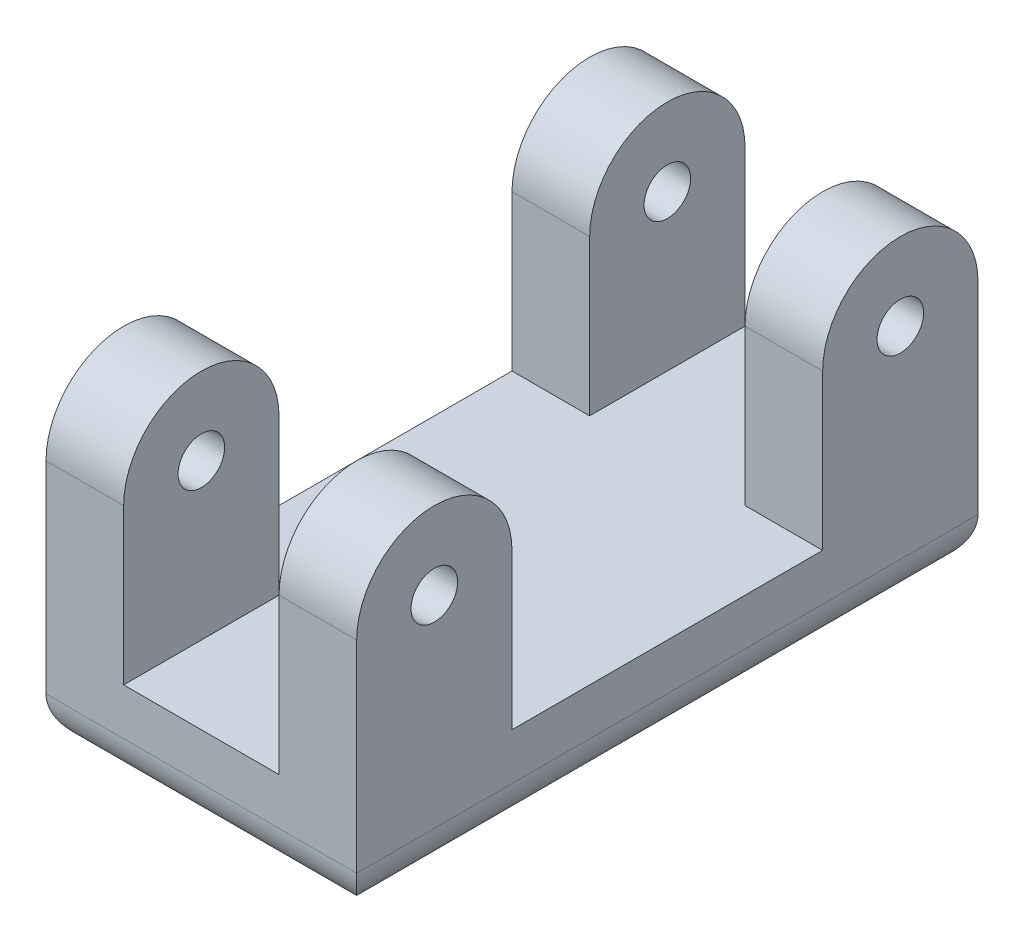
ISO-10303-21;
HEADER;
FILE_DESCRIPTION(('STEP AP214'),'2;1');
FILE_NAME('part.step','',(''),(''),'','','');
FILE_SCHEMA(('AUTOMOTIVE_DESIGN { 1 0 10303 214 1 1 1 1 }'));
ENDSEC;
DATA;
#1=APPLICATION_CONTEXT('core data for automotive mechanical design processes');
#2=APPLICATION_PROTOCOL_DEFINITION('international standard','automotive_design',2000,#1);
#3=PRODUCT_CONTEXT('',#1,'mechanical');
#4=PRODUCT('Part','Part','',(#3));
#5=PRODUCT_RELATED_PRODUCT_CATEGORY('part','',(#4));
#6=PRODUCT_DEFINITION_FORMATION('','',#4);
#7=PRODUCT_DEFINITION_CONTEXT('part definition',#1,'design');
#8=PRODUCT_DEFINITION('design','',#6,#7);
#9=PRODUCT_DEFINITION_SHAPE('','',#8);
#10=(LENGTH_UNIT() NAMED_UNIT(*) SI_UNIT(.MILLI.,.METRE.));
#11=(NAMED_UNIT(*) PLANE_ANGLE_UNIT() SI_UNIT($,.RADIAN.));
#12=(NAMED_UNIT(*) SI_UNIT($,.STERADIAN.) SOLID_ANGLE_UNIT());
#13=UNCERTAINTY_MEASURE_WITH_UNIT(LENGTH_MEASURE(1.E-05),#10,'distance_accuracy_value','');
#14=(GEOMETRIC_REPRESENTATION_CONTEXT(3) GLOBAL_UNCERTAINTY_ASSIGNED_CONTEXT((#13)) GLOBAL_UNIT_ASSIGNED_CONTEXT((#10,
#11,#12)) REPRESENTATION_CONTEXT('',''));
#15=CARTESIAN_POINT('',(0.,0.,0.));
#16=DIRECTION('',(0.,0.,1.));
#17=DIRECTION('',(1.,0.,0.));
#18=AXIS2_PLACEMENT_3D('',#15,#16,#17);
#19=CARTESIAN_POINT('',(-10.,0.,10.));
#20=DIRECTION('',(0.,0.,-1.));
#21=DIRECTION('',(-1.,0.,0.));
#22=AXIS2_PLACEMENT_3D('',#19,#20,#21);
#23=PLANE('',#22);
#24=DIRECTION('',(0.,1.,0.));
#25=VECTOR('',#24,1.);
#26=CARTESIAN_POINT('',(-5.,0.,10.));
#27=LINE('',#26,#25);
#28=CARTESIAN_POINT('',(-5.,3.,10.));
#29=VERTEX_POINT('',#28);
#30=CARTESIAN_POINT('',(-5.,13.,10.));
#31=VERTEX_POINT('',#30);
#32=EDGE_CURVE('E243',#29,#31,#27,.T.);
#33=ORIENTED_EDGE('',*,*,#32,.F.);
#34=DIRECTION('',(1.,0.,0.));
#35=VECTOR('',#34,1.);
#36=CARTESIAN_POINT('',(-10.,3.,10.));
#37=LINE('',#36,#35);
#38=CARTESIAN_POINT('',(-10.,3.,10.));
#39=VERTEX_POINT('',#38);
#40=EDGE_CURVE('E310',#39,#29,#37,.T.);
#41=ORIENTED_EDGE('',*,*,#40,.F.);
#42=DIRECTION('',(0.,1.,0.));
#43=VECTOR('',#42,1.);
#44=CARTESIAN_POINT('',(-10.,0.,10.));
#45=LINE('',#44,#43);
#46=CARTESIAN_POINT('',(-10.,13.,10.));
#47=VERTEX_POINT('',#46);
#48=EDGE_CURVE('E290',#39,#47,#45,.T.);
#49=ORIENTED_EDGE('',*,*,#48,.T.);
#50=DIRECTION('',(1.,0.,0.));
#51=VECTOR('',#50,1.);
#52=CARTESIAN_POINT('',(-10.,13.,10.));
#53=LINE('',#52,#51);
#54=EDGE_CURVE('E321',#47,#31,#53,.T.);
#55=ORIENTED_EDGE('',*,*,#54,.T.);
#56=EDGE_LOOP('',(#33,#41,#49,#55));
#57=FACE_BOUND('',#56,.T.);
#58=ADVANCED_FACE('F41',(#57),#23,.T.);
#59=CARTESIAN_POINT('',(-10.,13.,15.));
#60=DIRECTION('',(1.,0.,0.));
#61=DIRECTION('',(0.,0.,-1.));
#62=AXIS2_PLACEMENT_3D('',#59,#60,#61);
#63=CYLINDRICAL_SURFACE('',#62,1.5);
#64=CARTESIAN_POINT('',(-5.,13.,15.));
#65=DIRECTION('',(-1.,0.,0.));
#66=DIRECTION('',(0.,-1.,0.));
#67=AXIS2_PLACEMENT_3D('',#64,#65,#66);
#68=CIRCLE('',#67,1.5);
#69=CARTESIAN_POINT('',(-5.,11.5,15.));
#70=VERTEX_POINT('',#69);
#71=EDGE_CURVE('E246',#70,#70,#68,.F.);
#72=ORIENTED_EDGE('',*,*,#71,.T.);
#73=EDGE_LOOP('',(#72));
#74=FACE_BOUND('',#73,.T.);
#75=CARTESIAN_POINT('',(-10.,13.,15.));
#76=DIRECTION('',(1.,0.,0.));
#77=DIRECTION('',(0.,0.,-1.));
#78=AXIS2_PLACEMENT_3D('',#75,#76,#77);
#79=CIRCLE('',#78,1.5);
#80=CARTESIAN_POINT('',(-10.,13.,13.5));
#81=VERTEX_POINT('',#80);
#82=EDGE_CURVE('E286',#81,#81,#79,.T.);
#83=ORIENTED_EDGE('',*,*,#82,.F.);
#84=EDGE_LOOP('',(#83));
#85=FACE_BOUND('',#84,.T.);
#86=ADVANCED_FACE('F416',(#74,#85),#63,.F.);
#87=CARTESIAN_POINT('',(-10.,13.,15.));
#88=DIRECTION('',(1.,0.,0.));
#89=DIRECTION('',(0.,0.,-1.));
#90=AXIS2_PLACEMENT_3D('',#87,#88,#89);
#91=CYLINDRICAL_SURFACE('',#90,5.);
#92=DIRECTION('',(1.,0.,0.));
#93=VECTOR('',#92,1.);
#94=CARTESIAN_POINT('',(-10.,13.,20.));
#95=LINE('',#94,#93);
#96=CARTESIAN_POINT('',(-10.,13.,20.));
#97=VERTEX_POINT('',#96);
#98=CARTESIAN_POINT('',(-5.,13.,20.));
#99=VERTEX_POINT('',#98);
#100=EDGE_CURVE('E316',#97,#99,#95,.T.);
#101=ORIENTED_EDGE('',*,*,#100,.T.);
#102=CARTESIAN_POINT('',(-5.,13.,15.));
#103=DIRECTION('',(-1.,0.,0.));
#104=DIRECTION('',(0.,-1.,0.));
#105=AXIS2_PLACEMENT_3D('',#102,#103,#104);
#106=CIRCLE('',#105,5.);
#107=EDGE_CURVE('E240',#31,#99,#106,.F.);
#108=ORIENTED_EDGE('',*,*,#107,.F.);
#109=ORIENTED_EDGE('',*,*,#54,.F.);
#110=CARTESIAN_POINT('',(-10.,13.,15.));
#111=DIRECTION('',(1.,0.,0.));
#112=DIRECTION('',(0.,0.,-1.));
#113=AXIS2_PLACEMENT_3D('',#110,#111,#112);
#114=CIRCLE('',#113,5.);
#115=EDGE_CURVE('E295',#47,#97,#114,.T.);
#116=ORIENTED_EDGE('',*,*,#115,.T.);
#117=EDGE_LOOP('',(#101,#108,#109,#116));
#118=FACE_BOUND('',#117,.T.);
#119=ADVANCED_FACE('F423',(#118),#91,.T.);
#120=CARTESIAN_POINT('',(-10.,13.,-15.));
#121=DIRECTION('',(1.,0.,0.));
#122=DIRECTION('',(0.,0.,-1.));
#123=AXIS2_PLACEMENT_3D('',#120,#121,#122);
#124=CYLINDRICAL_SURFACE('',#123,5.);
#125=CARTESIAN_POINT('',(-5.,13.,-15.));
#126=DIRECTION('',(-1.,0.,0.));
#127=DIRECTION('',(0.,-1.,0.));
#128=AXIS2_PLACEMENT_3D('',#125,#126,#127);
#129=CIRCLE('',#128,5.);
#130=CARTESIAN_POINT('',(-5.,13.,-20.));
#131=VERTEX_POINT('',#130);
#132=CARTESIAN_POINT('',(-5.,13.,-10.));
#133=VERTEX_POINT('',#132);
#134=EDGE_CURVE('E233',#131,#133,#129,.F.);
#135=ORIENTED_EDGE('',*,*,#134,.F.);
#136=DIRECTION('',(1.,0.,0.));
#137=VECTOR('',#136,1.);
#138=CARTESIAN_POINT('',(-10.,13.,-20.));
#139=LINE('',#138,#137);
#140=CARTESIAN_POINT('',(-10.,13.,-20.));
#141=VERTEX_POINT('',#140);
#142=EDGE_CURVE('E197',#141,#131,#139,.T.);
#143=ORIENTED_EDGE('',*,*,#142,.F.);
#144=CARTESIAN_POINT('',(-10.,13.,-15.));
#145=DIRECTION('',(1.,0.,0.));
#146=DIRECTION('',(0.,0.,-1.));
#147=AXIS2_PLACEMENT_3D('',#144,#145,#146);
#148=CIRCLE('',#147,5.);
#149=CARTESIAN_POINT('',(-10.,13.,-10.));
#150=VERTEX_POINT('',#149);
#151=EDGE_CURVE('E255',#141,#150,#148,.T.);
#152=ORIENTED_EDGE('',*,*,#151,.T.);
#153=DIRECTION('',(1.,0.,0.));
#154=VECTOR('',#153,1.);
#155=CARTESIAN_POINT('',(-10.,13.,-10.));
#156=LINE('',#155,#154);
#157=EDGE_CURVE('E282',#150,#133,#156,.T.);
#158=ORIENTED_EDGE('',*,*,#157,.T.);
#159=EDGE_LOOP('',(#135,#143,#152,#158));
#160=FACE_BOUND('',#159,.T.);
#161=ADVANCED_FACE('F480',(#160),#124,.T.);
#162=CARTESIAN_POINT('',(-10.,13.,-15.));
#163=DIRECTION('',(1.,0.,0.));
#164=DIRECTION('',(0.,0.,-1.));
#165=AXIS2_PLACEMENT_3D('',#162,#163,#164);
#166=CYLINDRICAL_SURFACE('',#165,1.5);
#167=CARTESIAN_POINT('',(-5.,13.,-15.));
#168=DIRECTION('',(-1.,0.,0.));
#169=DIRECTION('',(0.,-1.,0.));
#170=AXIS2_PLACEMENT_3D('',#167,#168,#169);
#171=CIRCLE('',#170,1.5);
#172=CARTESIAN_POINT('',(-5.,11.5,-15.));
#173=VERTEX_POINT('',#172);
#174=EDGE_CURVE('E236',#173,#173,#171,.F.);
#175=ORIENTED_EDGE('',*,*,#174,.T.);
#176=EDGE_LOOP('',(#175));
#177=FACE_BOUND('',#176,.T.);
#178=CARTESIAN_POINT('',(-10.,13.,-15.));
#179=DIRECTION('',(1.,0.,0.));
#180=DIRECTION('',(0.,0.,-1.));
#181=AXIS2_PLACEMENT_3D('',#178,#179,#180);
#182=CIRCLE('',#181,1.5);
#183=CARTESIAN_POINT('',(-10.,13.,-16.5));
#184=VERTEX_POINT('',#183);
#185=EDGE_CURVE('E251',#184,#184,#182,.T.);
#186=ORIENTED_EDGE('',*,*,#185,.F.);
#187=EDGE_LOOP('',(#186));
#188=FACE_BOUND('',#187,.T.);
#189=ADVANCED_FACE('F487',(#177,#188),#166,.F.);
#190=CARTESIAN_POINT('',(-10.,0.,-10.));
#191=DIRECTION('',(0.,0.,-1.));
#192=DIRECTION('',(-1.,0.,0.));
#193=AXIS2_PLACEMENT_3D('',#190,#191,#192);
#194=PLANE('',#193);
#195=DIRECTION('',(1.,0.,0.));
#196=VECTOR('',#195,1.);
#197=CARTESIAN_POINT('',(-10.,3.,-10.));
#198=LINE('',#197,#196);
#199=CARTESIAN_POINT('',(-10.,3.,-10.));
#200=VERTEX_POINT('',#199);
#201=CARTESIAN_POINT('',(-5.,3.,-10.));
#202=VERTEX_POINT('',#201);
#203=EDGE_CURVE('E278',#200,#202,#198,.T.);
#204=ORIENTED_EDGE('',*,*,#203,.T.);
#205=DIRECTION('',(0.,1.,0.));
#206=VECTOR('',#205,1.);
#207=CARTESIAN_POINT('',(-5.,0.,-10.));
#208=LINE('',#207,#206);
#209=EDGE_CURVE('E176',#202,#133,#208,.T.);
#210=ORIENTED_EDGE('',*,*,#209,.T.);
#211=ORIENTED_EDGE('',*,*,#157,.F.);
#212=DIRECTION('',(0.,1.,0.));
#213=VECTOR('',#212,1.);
#214=CARTESIAN_POINT('',(-10.,0.,-10.));
#215=LINE('',#214,#213);
#216=EDGE_CURVE('E260',#200,#150,#215,.T.);
#217=ORIENTED_EDGE('',*,*,#216,.F.);
#218=EDGE_LOOP('',(#204,#210,#211,#217));
#219=FACE_BOUND('',#218,.T.);
#220=ADVANCED_FACE('F495',(#219),#194,.F.);
#221=CARTESIAN_POINT('',(-10.,3.,-20.));
#222=DIRECTION('',(0.,1.,0.));
#223=DIRECTION('',(0.,0.,1.));
#224=AXIS2_PLACEMENT_3D('',#221,#222,#223);
#225=PLANE('',#224);
#226=CARTESIAN_POINT('',(5.,3.,-10.));
#227=VERTEX_POINT('',#226);
#228=CARTESIAN_POINT('',(10.,3.,-10.));
#229=VERTEX_POINT('',#228);
#230=EDGE_CURVE('E281',#227,#229,#198,.T.);
#231=ORIENTED_EDGE('',*,*,#230,.F.);
#232=DIRECTION('',(0.,0.,1.));
#233=VECTOR('',#232,1.);
#234=CARTESIAN_POINT('',(5.,3.,-20.));
#235=LINE('',#234,#233);
#236=CARTESIAN_POINT('',(5.,3.,-20.));
#237=VERTEX_POINT('',#236);
#238=EDGE_CURVE('E187',#237,#227,#235,.T.);
#239=ORIENTED_EDGE('',*,*,#238,.F.);
#240=DIRECTION('',(1.,0.,0.));
#241=VECTOR('',#240,1.);
#242=CARTESIAN_POINT('',(-5.,3.,-20.));
#243=LINE('',#242,#241);
#244=CARTESIAN_POINT('',(-5.,3.,-20.));
#245=VERTEX_POINT('',#244);
#246=EDGE_CURVE('E184',#245,#237,#243,.T.);
#247=ORIENTED_EDGE('',*,*,#246,.F.);
#248=DIRECTION('',(0.,0.,1.));
#249=VECTOR('',#248,1.);
#250=CARTESIAN_POINT('',(-5.,3.,-20.));
#251=LINE('',#250,#249);
#252=EDGE_CURVE('E168',#245,#202,#251,.T.);
#253=ORIENTED_EDGE('',*,*,#252,.T.);
#254=ORIENTED_EDGE('',*,*,#203,.F.);
#255=DIRECTION('',(0.,0.,1.));
#256=VECTOR('',#255,1.);
#257=CARTESIAN_POINT('',(-10.,3.,-20.));
#258=LINE('',#257,#256);
#259=EDGE_CURVE('E337',#200,#39,#258,.T.);
#260=ORIENTED_EDGE('',*,*,#259,.T.);
#261=ORIENTED_EDGE('',*,*,#40,.T.);
#262=CARTESIAN_POINT('',(-5.,3.,20.));
#263=VERTEX_POINT('',#262);
#264=EDGE_CURVE('E181',#29,#263,#251,.T.);
#265=ORIENTED_EDGE('',*,*,#264,.T.);
#266=DIRECTION('',(1.,0.,0.));
#267=VECTOR('',#266,1.);
#268=CARTESIAN_POINT('',(-5.,3.,20.));
#269=LINE('',#268,#267);
#270=CARTESIAN_POINT('',(5.,3.,20.));
#271=VERTEX_POINT('',#270);
#272=EDGE_CURVE('E203',#263,#271,#269,.T.);
#273=ORIENTED_EDGE('',*,*,#272,.T.);
#274=CARTESIAN_POINT('',(5.,3.,10.));
#275=VERTEX_POINT('',#274);
#276=EDGE_CURVE('E180',#275,#271,#235,.T.);
#277=ORIENTED_EDGE('',*,*,#276,.F.);
#278=CARTESIAN_POINT('',(10.,3.,10.));
#279=VERTEX_POINT('',#278);
#280=EDGE_CURVE('E315',#275,#279,#37,.T.);
#281=ORIENTED_EDGE('',*,*,#280,.T.);
#282=DIRECTION('',(0.,0.,1.));
#283=VECTOR('',#282,1.);
#284=CARTESIAN_POINT('',(10.,3.,-20.));
#285=LINE('',#284,#283);
#286=EDGE_CURVE('E336',#229,#279,#285,.T.);
#287=ORIENTED_EDGE('',*,*,#286,.F.);
#288=EDGE_LOOP('',(#231,#239,#247,#253,#254,#260,#261,#265,#273,#277,#281,#287));
#289=FACE_BOUND('',#288,.T.);
#290=ADVANCED_FACE('F186',(#289),#225,.T.);
#291=CARTESIAN_POINT('',(10.,3.,-20.));
#292=DIRECTION('',(1.,0.,0.));
#293=DIRECTION('',(0.,0.,-1.));
#294=AXIS2_PLACEMENT_3D('',#291,#292,#293);
#295=PLANE('',#294);
#296=DIRECTION('',(0.,1.,0.));
#297=VECTOR('',#296,1.);
#298=CARTESIAN_POINT('',(10.,3.,20.));
#299=LINE('',#298,#297);
#300=CARTESIAN_POINT('',(10.,0.,20.));
#301=VERTEX_POINT('',#300);
#302=CARTESIAN_POINT('',(10.,13.,20.));
#303=VERTEX_POINT('',#302);
#304=EDGE_CURVE('E314',#301,#303,#299,.T.);
#305=ORIENTED_EDGE('',*,*,#304,.F.);
#306=DIRECTION('',(0.,0.,1.));
#307=VECTOR('',#306,1.);
#308=CARTESIAN_POINT('',(10.,0.,-20.));
#309=LINE('',#308,#307);
#310=CARTESIAN_POINT('',(10.,0.,-20.));
#311=VERTEX_POINT('',#310);
#312=EDGE_CURVE('E11',#301,#311,#309,.F.);
#313=ORIENTED_EDGE('',*,*,#312,.T.);
#314=DIRECTION('',(0.,1.,0.));
#315=VECTOR('',#314,1.);
#316=CARTESIAN_POINT('',(10.,3.,-20.));
#317=LINE('',#316,#315);
#318=CARTESIAN_POINT('',(10.,13.,-20.));
#319=VERTEX_POINT('',#318);
#320=EDGE_CURVE('E330',#311,#319,#317,.T.);
#321=ORIENTED_EDGE('',*,*,#320,.T.);
#322=CARTESIAN_POINT('',(10.,13.,-15.));
#323=DIRECTION('',(1.,0.,0.));
#324=DIRECTION('',(0.,0.,-1.));
#325=AXIS2_PLACEMENT_3D('',#322,#323,#324);
#326=CIRCLE('',#325,5.);
#327=CARTESIAN_POINT('',(10.,13.,-10.));
#328=VERTEX_POINT('',#327);
#329=EDGE_CURVE('E267',#319,#328,#326,.T.);
#330=ORIENTED_EDGE('',*,*,#329,.T.);
#331=DIRECTION('',(0.,1.,0.));
#332=VECTOR('',#331,1.);
#333=CARTESIAN_POINT('',(10.,0.,-10.));
#334=LINE('',#333,#332);
#335=EDGE_CURVE('E256',#229,#328,#334,.T.);
#336=ORIENTED_EDGE('',*,*,#335,.F.);
#337=ORIENTED_EDGE('',*,*,#286,.T.);
#338=DIRECTION('',(0.,1.,0.));
#339=VECTOR('',#338,1.);
#340=CARTESIAN_POINT('',(10.,0.,10.));
#341=LINE('',#340,#339);
#342=CARTESIAN_POINT('',(10.,13.,10.));
#343=VERTEX_POINT('',#342);
#344=EDGE_CURVE('E303',#279,#343,#341,.T.);
#345=ORIENTED_EDGE('',*,*,#344,.T.);
#346=CARTESIAN_POINT('',(10.,13.,15.));
#347=DIRECTION('',(1.,0.,0.));
#348=DIRECTION('',(0.,0.,-1.));
#349=AXIS2_PLACEMENT_3D('',#346,#347,#348);
#350=CIRCLE('',#349,5.);
#351=EDGE_CURVE('E291',#343,#303,#350,.T.);
#352=ORIENTED_EDGE('',*,*,#351,.T.);
#353=EDGE_LOOP('',(#305,#313,#321,#330,#336,#337,#345,#352));
#354=FACE_BOUND('',#353,.T.);
#355=CARTESIAN_POINT('',(10.,13.,15.));
#356=DIRECTION('',(1.,0.,0.));
#357=DIRECTION('',(0.,0.,-1.));
#358=AXIS2_PLACEMENT_3D('',#355,#356,#357);
#359=CIRCLE('',#358,1.5);
#360=CARTESIAN_POINT('',(10.,13.,13.5));
#361=VERTEX_POINT('',#360);
#362=EDGE_CURVE('E276',#361,#361,#359,.T.);
#363=ORIENTED_EDGE('',*,*,#362,.F.);
#364=EDGE_LOOP('',(#363));
#365=FACE_BOUND('',#364,.T.);
#366=CARTESIAN_POINT('',(10.,13.,-15.));
#367=DIRECTION('',(1.,0.,0.));
#368=DIRECTION('',(0.,0.,-1.));
#369=AXIS2_PLACEMENT_3D('',#366,#367,#368);
#370=CIRCLE('',#369,1.5);
#371=CARTESIAN_POINT('',(10.,13.,-16.5));
#372=VERTEX_POINT('',#371);
#373=EDGE_CURVE('E250',#372,#372,#370,.T.);
#374=ORIENTED_EDGE('',*,*,#373,.F.);
#375=EDGE_LOOP('',(#374));
#376=FACE_BOUND('',#375,.T.);
#377=ADVANCED_FACE('F394',(#354,#365,#376),#295,.T.);
#378=CARTESIAN_POINT('',(-10.,-3.,-20.));
#379=DIRECTION('',(0.,-1.,0.));
#380=DIRECTION('',(0.,0.,-1.));
#381=AXIS2_PLACEMENT_3D('',#378,#379,#380);
#382=PLANE('',#381);
#383=DIRECTION('',(0.,0.,1.));
#384=VECTOR('',#383,1.);
#385=CARTESIAN_POINT('',(-7.,-3.,-20.));
#386=LINE('',#385,#384);
#387=CARTESIAN_POINT('',(-7.,-3.,17.));
#388=VERTEX_POINT('',#387);
#389=CARTESIAN_POINT('',(-7.,-3.,-17.));
#390=VERTEX_POINT('',#389);
#391=EDGE_CURVE('E355',#388,#390,#386,.F.);
#392=ORIENTED_EDGE('',*,*,#391,.T.);
#393=DIRECTION('',(1.,0.,0.));
#394=VECTOR('',#393,1.);
#395=CARTESIAN_POINT('',(9.99999999999999,-3.,-17.));
#396=LINE('',#395,#394);
#397=CARTESIAN_POINT('',(7.,-3.,-17.));
#398=VERTEX_POINT('',#397);
#399=EDGE_CURVE('E358',#390,#398,#396,.T.);
#400=ORIENTED_EDGE('',*,*,#399,.T.);
#401=DIRECTION('',(0.,0.,1.));
#402=VECTOR('',#401,1.);
#403=CARTESIAN_POINT('',(7.,-3.,-20.));
#404=LINE('',#403,#402);
#405=CARTESIAN_POINT('',(7.,-3.,17.));
#406=VERTEX_POINT('',#405);
#407=EDGE_CURVE('E349',#398,#406,#404,.T.);
#408=ORIENTED_EDGE('',*,*,#407,.T.);
#409=DIRECTION('',(1.,0.,0.));
#410=VECTOR('',#409,1.);
#411=CARTESIAN_POINT('',(-10.,-3.,17.));
#412=LINE('',#411,#410);
#413=EDGE_CURVE('E352',#406,#388,#412,.F.);
#414=ORIENTED_EDGE('',*,*,#413,.T.);
#415=EDGE_LOOP('',(#392,#400,#408,#414));
#416=FACE_BOUND('',#415,.T.);
#417=ADVANCED_FACE('F404',(#416),#382,.T.);
#418=CARTESIAN_POINT('',(-10.,3.,-20.));
#419=DIRECTION('',(-1.,0.,0.));
#420=DIRECTION('',(0.,-1.,0.));
#421=AXIS2_PLACEMENT_3D('',#418,#419,#420);
#422=PLANE('',#421);
#423=DIRECTION('',(0.,-1.,0.));
#424=VECTOR('',#423,1.);
#425=CARTESIAN_POINT('',(-10.,3.,-20.));
#426=LINE('',#425,#424);
#427=CARTESIAN_POINT('',(-10.,0.,-20.));
#428=VERTEX_POINT('',#427);
#429=EDGE_CURVE('E333',#141,#428,#426,.T.);
#430=ORIENTED_EDGE('',*,*,#429,.T.);
#431=DIRECTION('',(0.,0.,1.));
#432=VECTOR('',#431,1.);
#433=CARTESIAN_POINT('',(-10.,0.,-20.));
#434=LINE('',#433,#432);
#435=CARTESIAN_POINT('',(-10.,0.,20.));
#436=VERTEX_POINT('',#435);
#437=EDGE_CURVE('E66',#428,#436,#434,.T.);
#438=ORIENTED_EDGE('',*,*,#437,.T.);
#439=DIRECTION('',(0.,-1.,0.));
#440=VECTOR('',#439,1.);
#441=CARTESIAN_POINT('',(-10.,3.,20.));
#442=LINE('',#441,#440);
#443=EDGE_CURVE('E327',#97,#436,#442,.T.);
#444=ORIENTED_EDGE('',*,*,#443,.F.);
#445=ORIENTED_EDGE('',*,*,#115,.F.);
#446=ORIENTED_EDGE('',*,*,#48,.F.);
#447=ORIENTED_EDGE('',*,*,#259,.F.);
#448=ORIENTED_EDGE('',*,*,#216,.T.);
#449=ORIENTED_EDGE('',*,*,#151,.F.);
#450=EDGE_LOOP('',(#430,#438,#444,#445,#446,#447,#448,#449));
#451=FACE_BOUND('',#450,.T.);
#452=ORIENTED_EDGE('',*,*,#82,.T.);
#453=EDGE_LOOP('',(#452));
#454=FACE_BOUND('',#453,.T.);
#455=ORIENTED_EDGE('',*,*,#185,.T.);
#456=EDGE_LOOP('',(#455));
#457=FACE_BOUND('',#456,.T.);
#458=ADVANCED_FACE('F406',(#451,#454,#457),#422,.T.);
#459=CARTESIAN_POINT('',(0.,0.,-20.));
#460=DIRECTION('',(0.,0.,1.));
#461=DIRECTION('',(1.,0.,0.));
#462=AXIS2_PLACEMENT_3D('',#459,#460,#461);
#463=PLANE('',#462);
#464=ORIENTED_EDGE('',*,*,#320,.F.);
#465=DIRECTION('',(1.,0.,0.));
#466=VECTOR('',#465,1.);
#467=CARTESIAN_POINT('',(-10.,0.,-20.));
#468=LINE('',#467,#466);
#469=EDGE_CURVE('E362',#311,#428,#468,.F.);
#470=ORIENTED_EDGE('',*,*,#469,.T.);
#471=ORIENTED_EDGE('',*,*,#429,.F.);
#472=ORIENTED_EDGE('',*,*,#142,.T.);
#473=DIRECTION('',(0.,-1.,0.));
#474=VECTOR('',#473,1.);
#475=CARTESIAN_POINT('',(-5.,18.,-20.));
#476=LINE('',#475,#474);
#477=EDGE_CURVE('E173',#131,#245,#476,.T.);
#478=ORIENTED_EDGE('',*,*,#477,.T.);
#479=ORIENTED_EDGE('',*,*,#246,.T.);
#480=DIRECTION('',(0.,1.,0.));
#481=VECTOR('',#480,1.);
#482=CARTESIAN_POINT('',(5.,18.,-20.));
#483=LINE('',#482,#481);
#484=CARTESIAN_POINT('',(5.,13.,-20.));
#485=VERTEX_POINT('',#484);
#486=EDGE_CURVE('E192',#237,#485,#483,.T.);
#487=ORIENTED_EDGE('',*,*,#486,.T.);
#488=EDGE_CURVE('E277',#485,#319,#139,.T.);
#489=ORIENTED_EDGE('',*,*,#488,.T.);
#490=EDGE_LOOP('',(#464,#470,#471,#472,#478,#479,#487,#489));
#491=FACE_BOUND('',#490,.T.);
#492=ADVANCED_FACE('F195',(#491),#463,.F.);
#493=CARTESIAN_POINT('',(0.,0.,20.));
#494=DIRECTION('',(0.,0.,1.));
#495=DIRECTION('',(1.,0.,0.));
#496=AXIS2_PLACEMENT_3D('',#493,#494,#495);
#497=PLANE('',#496);
#498=ORIENTED_EDGE('',*,*,#443,.T.);
#499=DIRECTION('',(1.,0.,0.));
#500=VECTOR('',#499,1.);
#501=CARTESIAN_POINT('',(0.,0.,20.));
#502=LINE('',#501,#500);
#503=EDGE_CURVE('E51',#436,#301,#502,.T.);
#504=ORIENTED_EDGE('',*,*,#503,.T.);
#505=ORIENTED_EDGE('',*,*,#304,.T.);
#506=CARTESIAN_POINT('',(5.,13.,20.));
#507=VERTEX_POINT('',#506);
#508=EDGE_CURVE('E320',#507,#303,#95,.T.);
#509=ORIENTED_EDGE('',*,*,#508,.F.);
#510=DIRECTION('',(0.,1.,0.));
#511=VECTOR('',#510,1.);
#512=CARTESIAN_POINT('',(5.,18.,20.));
#513=LINE('',#512,#511);
#514=EDGE_CURVE('E199',#271,#507,#513,.T.);
#515=ORIENTED_EDGE('',*,*,#514,.F.);
#516=ORIENTED_EDGE('',*,*,#272,.F.);
#517=DIRECTION('',(0.,-1.,0.));
#518=VECTOR('',#517,1.);
#519=CARTESIAN_POINT('',(-5.,18.,20.));
#520=LINE('',#519,#518);
#521=EDGE_CURVE('E208',#99,#263,#520,.T.);
#522=ORIENTED_EDGE('',*,*,#521,.F.);
#523=ORIENTED_EDGE('',*,*,#100,.F.);
#524=EDGE_LOOP('',(#498,#504,#505,#509,#515,#516,#522,#523));
#525=FACE_BOUND('',#524,.T.);
#526=ADVANCED_FACE('F430',(#525),#497,.T.);
#527=DIRECTION('',(0.,-1.,0.));
#528=VECTOR('',#527,1.);
#529=CARTESIAN_POINT('',(5.,0.,10.));
#530=LINE('',#529,#528);
#531=CARTESIAN_POINT('',(5.,13.,10.));
#532=VERTEX_POINT('',#531);
#533=EDGE_CURVE('E226',#532,#275,#530,.T.);
#534=ORIENTED_EDGE('',*,*,#533,.F.);
#535=EDGE_CURVE('E299',#532,#343,#53,.T.);
#536=ORIENTED_EDGE('',*,*,#535,.T.);
#537=ORIENTED_EDGE('',*,*,#344,.F.);
#538=ORIENTED_EDGE('',*,*,#280,.F.);
#539=EDGE_LOOP('',(#534,#536,#537,#538));
#540=FACE_BOUND('',#539,.T.);
#541=ADVANCED_FACE('F419',(#540),#23,.T.);
#542=CARTESIAN_POINT('',(5.,13.,15.));
#543=DIRECTION('',(1.,0.,0.));
#544=DIRECTION('',(0.,1.,0.));
#545=AXIS2_PLACEMENT_3D('',#542,#543,#544);
#546=CIRCLE('',#545,1.5);
#547=CARTESIAN_POINT('',(5.,14.5,15.));
#548=VERTEX_POINT('',#547);
#549=EDGE_CURVE('E229',#548,#548,#546,.F.);
#550=ORIENTED_EDGE('',*,*,#549,.T.);
#551=EDGE_LOOP('',(#550));
#552=FACE_BOUND('',#551,.T.);
#553=ORIENTED_EDGE('',*,*,#362,.T.);
#554=EDGE_LOOP('',(#553));
#555=FACE_BOUND('',#554,.T.);
#556=ADVANCED_FACE('F426',(#552,#555),#63,.F.);
#557=CARTESIAN_POINT('',(5.,13.,15.));
#558=DIRECTION('',(1.,0.,0.));
#559=DIRECTION('',(0.,1.,0.));
#560=AXIS2_PLACEMENT_3D('',#557,#558,#559);
#561=CIRCLE('',#560,5.);
#562=EDGE_CURVE('E223',#507,#532,#561,.F.);
#563=ORIENTED_EDGE('',*,*,#562,.F.);
#564=ORIENTED_EDGE('',*,*,#508,.T.);
#565=ORIENTED_EDGE('',*,*,#351,.F.);
#566=ORIENTED_EDGE('',*,*,#535,.F.);
#567=EDGE_LOOP('',(#563,#564,#565,#566));
#568=FACE_BOUND('',#567,.T.);
#569=ADVANCED_FACE('F436',(#568),#91,.T.);
#570=ORIENTED_EDGE('',*,*,#488,.F.);
#571=CARTESIAN_POINT('',(5.,13.,-15.));
#572=DIRECTION('',(1.,0.,0.));
#573=DIRECTION('',(0.,1.,0.));
#574=AXIS2_PLACEMENT_3D('',#571,#572,#573);
#575=CIRCLE('',#574,5.);
#576=CARTESIAN_POINT('',(5.,13.,-10.));
#577=VERTEX_POINT('',#576);
#578=EDGE_CURVE('E215',#577,#485,#575,.F.);
#579=ORIENTED_EDGE('',*,*,#578,.F.);
#580=EDGE_CURVE('E263',#577,#328,#156,.T.);
#581=ORIENTED_EDGE('',*,*,#580,.T.);
#582=ORIENTED_EDGE('',*,*,#329,.F.);
#583=EDGE_LOOP('',(#570,#579,#581,#582));
#584=FACE_BOUND('',#583,.T.);
#585=ADVANCED_FACE('F476',(#584),#124,.T.);
#586=CARTESIAN_POINT('',(5.,13.,-15.));
#587=DIRECTION('',(1.,0.,0.));
#588=DIRECTION('',(0.,1.,0.));
#589=AXIS2_PLACEMENT_3D('',#586,#587,#588);
#590=CIRCLE('',#589,1.5);
#591=CARTESIAN_POINT('',(5.,14.5,-15.));
#592=VERTEX_POINT('',#591);
#593=EDGE_CURVE('E219',#592,#592,#590,.F.);
#594=ORIENTED_EDGE('',*,*,#593,.T.);
#595=EDGE_LOOP('',(#594));
#596=FACE_BOUND('',#595,.T.);
#597=ORIENTED_EDGE('',*,*,#373,.T.);
#598=EDGE_LOOP('',(#597));
#599=FACE_BOUND('',#598,.T.);
#600=ADVANCED_FACE('F478',(#596,#599),#166,.F.);
#601=ORIENTED_EDGE('',*,*,#580,.F.);
#602=DIRECTION('',(0.,-1.,0.));
#603=VECTOR('',#602,1.);
#604=CARTESIAN_POINT('',(5.,0.,-10.));
#605=LINE('',#604,#603);
#606=EDGE_CURVE('E340',#577,#227,#605,.T.);
#607=ORIENTED_EDGE('',*,*,#606,.T.);
#608=ORIENTED_EDGE('',*,*,#230,.T.);
#609=ORIENTED_EDGE('',*,*,#335,.T.);
#610=EDGE_LOOP('',(#601,#607,#608,#609));
#611=FACE_BOUND('',#610,.T.);
#612=ADVANCED_FACE('F470',(#611),#194,.F.);
#613=CARTESIAN_POINT('',(5.,18.,-20.));
#614=DIRECTION('',(1.,0.,0.));
#615=DIRECTION('',(0.,1.,0.));
#616=AXIS2_PLACEMENT_3D('',#613,#614,#615);
#617=PLANE('',#616);
#618=ORIENTED_EDGE('',*,*,#578,.T.);
#619=ORIENTED_EDGE('',*,*,#486,.F.);
#620=ORIENTED_EDGE('',*,*,#238,.T.);
#621=ORIENTED_EDGE('',*,*,#606,.F.);
#622=EDGE_LOOP('',(#618,#619,#620,#621));
#623=FACE_BOUND('',#622,.T.);
#624=ORIENTED_EDGE('',*,*,#593,.F.);
#625=EDGE_LOOP('',(#624));
#626=FACE_BOUND('',#625,.T.);
#627=ADVANCED_FACE('F473',(#623,#626),#617,.F.);
#628=CARTESIAN_POINT('',(-5.,18.,-20.));
#629=DIRECTION('',(-1.,0.,0.));
#630=DIRECTION('',(0.,-1.,0.));
#631=AXIS2_PLACEMENT_3D('',#628,#629,#630);
#632=PLANE('',#631);
#633=ORIENTED_EDGE('',*,*,#477,.F.);
#634=ORIENTED_EDGE('',*,*,#134,.T.);
#635=ORIENTED_EDGE('',*,*,#209,.F.);
#636=ORIENTED_EDGE('',*,*,#252,.F.);
#637=EDGE_LOOP('',(#633,#634,#635,#636));
#638=FACE_BOUND('',#637,.T.);
#639=ORIENTED_EDGE('',*,*,#174,.F.);
#640=EDGE_LOOP('',(#639));
#641=FACE_BOUND('',#640,.T.);
#642=ADVANCED_FACE('F170',(#638,#641),#632,.F.);
#643=ORIENTED_EDGE('',*,*,#32,.T.);
#644=ORIENTED_EDGE('',*,*,#107,.T.);
#645=ORIENTED_EDGE('',*,*,#521,.T.);
#646=ORIENTED_EDGE('',*,*,#264,.F.);
#647=EDGE_LOOP('',(#643,#644,#645,#646));
#648=FACE_BOUND('',#647,.T.);
#649=ORIENTED_EDGE('',*,*,#71,.F.);
#650=EDGE_LOOP('',(#649));
#651=FACE_BOUND('',#650,.T.);
#652=ADVANCED_FACE('F507',(#648,#651),#632,.F.);
#653=ORIENTED_EDGE('',*,*,#533,.T.);
#654=ORIENTED_EDGE('',*,*,#276,.T.);
#655=ORIENTED_EDGE('',*,*,#514,.T.);
#656=ORIENTED_EDGE('',*,*,#562,.T.);
#657=EDGE_LOOP('',(#653,#654,#655,#656));
#658=FACE_BOUND('',#657,.T.);
#659=ORIENTED_EDGE('',*,*,#549,.F.);
#660=EDGE_LOOP('',(#659));
#661=FACE_BOUND('',#660,.T.);
#662=ADVANCED_FACE('F463',(#658,#661),#617,.F.);
#663=CARTESIAN_POINT('',(0.,0.,17.));
#664=DIRECTION('',(1.,0.,0.));
#665=DIRECTION('',(0.,0.,-1.));
#666=AXIS2_PLACEMENT_3D('',#663,#664,#665);
#667=CYLINDRICAL_SURFACE('',#666,3.);
#668=CARTESIAN_POINT('',(7.,0.,17.));
#669=DIRECTION('',(-0.707106781186547,0.,0.707106781186547));
#670=DIRECTION('',(0.707106781186547,0.,0.707106781186547));
#671=AXIS2_PLACEMENT_3D('',#668,#669,#670);
#672=ELLIPSE('',#671,4.24264068711928,3.);
#673=EDGE_CURVE('E375',#301,#406,#672,.F.);
#674=ORIENTED_EDGE('',*,*,#673,.F.);
#675=ORIENTED_EDGE('',*,*,#503,.F.);
#676=CARTESIAN_POINT('',(-7.,0.,17.));
#677=DIRECTION('',(0.707106781186547,0.,0.707106781186547));
#678=DIRECTION('',(0.707106781186547,0.,-0.707106781186547));
#679=AXIS2_PLACEMENT_3D('',#676,#677,#678);
#680=ELLIPSE('',#679,4.24264068711928,3.);
#681=EDGE_CURVE('E45',#388,#436,#680,.F.);
#682=ORIENTED_EDGE('',*,*,#681,.F.);
#683=ORIENTED_EDGE('',*,*,#413,.F.);
#684=EDGE_LOOP('',(#674,#675,#682,#683));
#685=FACE_BOUND('',#684,.T.);
#686=ADVANCED_FACE('F43',(#685),#667,.T.);
#687=CARTESIAN_POINT('',(-7.,0.,-20.));
#688=DIRECTION('',(0.,0.,1.));
#689=DIRECTION('',(1.,0.,0.));
#690=AXIS2_PLACEMENT_3D('',#687,#688,#689);
#691=CYLINDRICAL_SURFACE('',#690,3.);
#692=ORIENTED_EDGE('',*,*,#681,.T.);
#693=ORIENTED_EDGE('',*,*,#437,.F.);
#694=CARTESIAN_POINT('',(-7.,0.,-17.));
#695=DIRECTION('',(-0.707106781186547,0.,0.707106781186547));
#696=DIRECTION('',(0.707106781186547,0.,0.707106781186547));
#697=AXIS2_PLACEMENT_3D('',#694,#695,#696);
#698=ELLIPSE('',#697,4.24264068711928,3.);
#699=EDGE_CURVE('E373',#390,#428,#698,.F.);
#700=ORIENTED_EDGE('',*,*,#699,.F.);
#701=ORIENTED_EDGE('',*,*,#391,.F.);
#702=EDGE_LOOP('',(#692,#693,#700,#701));
#703=FACE_BOUND('',#702,.T.);
#704=ADVANCED_FACE('F387',(#703),#691,.T.);
#705=CARTESIAN_POINT('',(7.,0.,-20.));
#706=DIRECTION('',(0.,0.,1.));
#707=DIRECTION('',(1.,0.,0.));
#708=AXIS2_PLACEMENT_3D('',#705,#706,#707);
#709=CYLINDRICAL_SURFACE('',#708,3.);
#710=ORIENTED_EDGE('',*,*,#673,.T.);
#711=ORIENTED_EDGE('',*,*,#407,.F.);
#712=CARTESIAN_POINT('',(7.,0.,-17.));
#713=DIRECTION('',(0.707106781186547,0.,0.707106781186547));
#714=DIRECTION('',(-0.707106781186547,0.,0.707106781186547));
#715=AXIS2_PLACEMENT_3D('',#712,#713,#714);
#716=ELLIPSE('',#715,4.24264068711928,3.);
#717=EDGE_CURVE('E370',#311,#398,#716,.F.);
#718=ORIENTED_EDGE('',*,*,#717,.F.);
#719=ORIENTED_EDGE('',*,*,#312,.F.);
#720=EDGE_LOOP('',(#710,#711,#718,#719));
#721=FACE_BOUND('',#720,.T.);
#722=ADVANCED_FACE('F392',(#721),#709,.T.);
#723=CARTESIAN_POINT('',(-10.,0.,-17.));
#724=DIRECTION('',(-1.,0.,0.));
#725=DIRECTION('',(0.,0.,1.));
#726=AXIS2_PLACEMENT_3D('',#723,#724,#725);
#727=CYLINDRICAL_SURFACE('',#726,3.);
#728=ORIENTED_EDGE('',*,*,#699,.T.);
#729=ORIENTED_EDGE('',*,*,#469,.F.);
#730=ORIENTED_EDGE('',*,*,#717,.T.);
#731=ORIENTED_EDGE('',*,*,#399,.F.);
#732=EDGE_LOOP('',(#728,#729,#730,#731));
#733=FACE_BOUND('',#732,.T.);
#734=ADVANCED_FACE('F401',(#733),#727,.T.);
#735=CLOSED_SHELL('',(#58,#86,#119,#161,#189,#220,#290,#377,#417,#458,#492,#526,#541,#556,#569,
#585,#600,#612,#627,#642,#652,#662,#686,#704,#722,#734));
#736=MANIFOLD_SOLID_BREP('B2',#735);
#737=ADVANCED_BREP_SHAPE_REPRESENTATION('',(#18,#736),#14);
#738=SHAPE_DEFINITION_REPRESENTATION(#9,#737);
ENDSEC;
END-ISO-10303-21;
